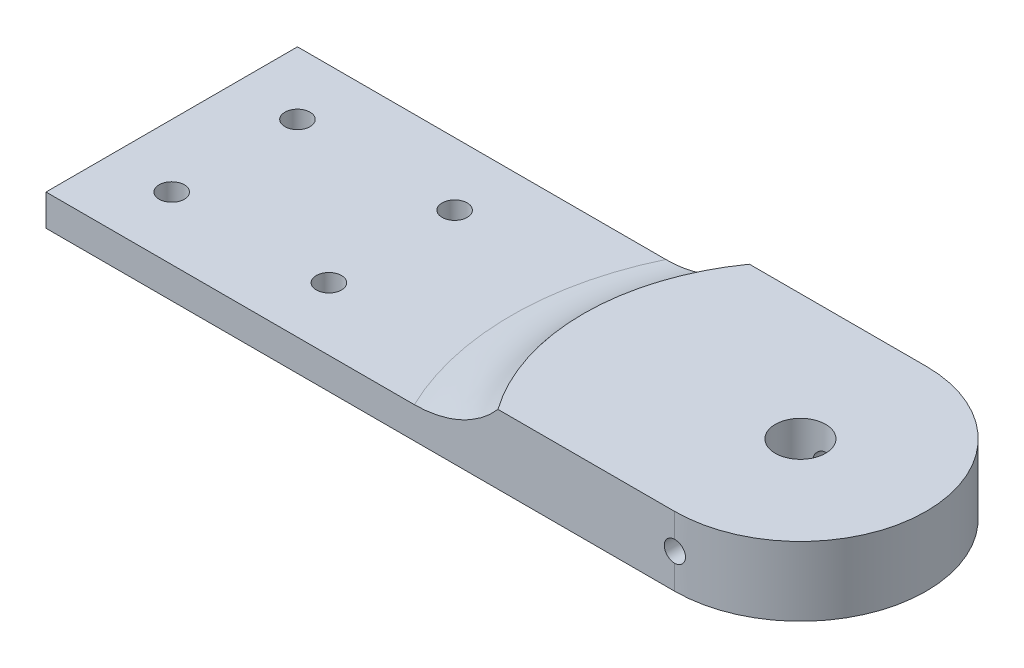
ISO-10303-21;
HEADER;
FILE_DESCRIPTION(('STEP AP214'),'2;1');
FILE_NAME('part.step','',(''),(''),'','','');
FILE_SCHEMA(('AUTOMOTIVE_DESIGN { 1 0 10303 214 1 1 1 1 }'));
ENDSEC;
DATA;
#1=APPLICATION_CONTEXT('core data for automotive mechanical design processes');
#2=APPLICATION_PROTOCOL_DEFINITION('international standard','automotive_design',2000,#1);
#3=PRODUCT_CONTEXT('',#1,'mechanical');
#4=PRODUCT('Part','Part','',(#3));
#5=PRODUCT_RELATED_PRODUCT_CATEGORY('part','',(#4));
#6=PRODUCT_DEFINITION_FORMATION('','',#4);
#7=PRODUCT_DEFINITION_CONTEXT('part definition',#1,'design');
#8=PRODUCT_DEFINITION('design','',#6,#7);
#9=PRODUCT_DEFINITION_SHAPE('','',#8);
#10=(LENGTH_UNIT() NAMED_UNIT(*) SI_UNIT(.MILLI.,.METRE.));
#11=(NAMED_UNIT(*) PLANE_ANGLE_UNIT() SI_UNIT($,.RADIAN.));
#12=(NAMED_UNIT(*) SI_UNIT($,.STERADIAN.) SOLID_ANGLE_UNIT());
#13=UNCERTAINTY_MEASURE_WITH_UNIT(LENGTH_MEASURE(1.E-05),#10,'distance_accuracy_value','');
#14=(GEOMETRIC_REPRESENTATION_CONTEXT(3) GLOBAL_UNCERTAINTY_ASSIGNED_CONTEXT((#13)) GLOBAL_UNIT_ASSIGNED_CONTEXT((#10,
#11,#12)) REPRESENTATION_CONTEXT('',''));
#15=CARTESIAN_POINT('',(0.,0.,0.));
#16=DIRECTION('',(0.,0.,1.));
#17=DIRECTION('',(1.,0.,0.));
#18=AXIS2_PLACEMENT_3D('',#15,#16,#17);
#19=CARTESIAN_POINT('',(0.,11.,20.));
#20=DIRECTION('',(0.,0.,1.));
#21=DIRECTION('',(1.,0.,0.));
#22=AXIS2_PLACEMENT_3D('',#19,#20,#21);
#23=PLANE('',#22);
#24=DIRECTION('',(0.,-1.,0.));
#25=VECTOR('',#24,1.);
#26=CARTESIAN_POINT('',(0.,11.,20.));
#27=LINE('',#26,#25);
#28=CARTESIAN_POINT('',(0.,3.85000000000001,20.));
#29=VERTEX_POINT('',#28);
#30=CARTESIAN_POINT('',(0.,0.,20.));
#31=VERTEX_POINT('',#30);
#32=EDGE_CURVE('E126',#29,#31,#27,.T.);
#33=ORIENTED_EDGE('',*,*,#32,.F.);
#34=CARTESIAN_POINT('',(0.,5.5,20.));
#35=DIRECTION('',(0.,0.,-1.));
#36=DIRECTION('',(-1.,0.,0.));
#37=AXIS2_PLACEMENT_3D('',#34,#35,#36);
#38=CIRCLE('',#37,1.64999999999999);
#39=CARTESIAN_POINT('',(0.,7.14999999999999,20.));
#40=VERTEX_POINT('',#39);
#41=EDGE_CURVE('E66',#29,#40,#38,.T.);
#42=ORIENTED_EDGE('',*,*,#41,.T.);
#43=CARTESIAN_POINT('',(0.,11.,20.));
#44=VERTEX_POINT('',#43);
#45=EDGE_CURVE('E123',#44,#40,#27,.T.);
#46=ORIENTED_EDGE('',*,*,#45,.F.);
#47=DIRECTION('',(-1.,0.,0.));
#48=VECTOR('',#47,1.);
#49=CARTESIAN_POINT('',(0.,11.,20.));
#50=LINE('',#49,#48);
#51=CARTESIAN_POINT('',(-28.1113855937412,11.,20.));
#52=VERTEX_POINT('',#51);
#53=EDGE_CURVE('E216',#44,#52,#50,.T.);
#54=ORIENTED_EDGE('',*,*,#53,.T.);
#55=CARTESIAN_POINT('',(-28.1113855937412,11.,20.));
#56=CARTESIAN_POINT('',(-28.2662442766593,10.8187919390475,20.));
#57=CARTESIAN_POINT('',(-28.4253331590326,10.641257561924,20.));
#58=CARTESIAN_POINT('',(-28.7514331358324,10.2936687575173,20.));
#59=CARTESIAN_POINT('',(-28.9184429983394,10.1236131749631,20.));
#60=CARTESIAN_POINT('',(-29.4303087027756,9.62508513091808,20.));
#61=CARTESIAN_POINT('',(-29.7862858891756,9.30791945492032,20.));
#62=CARTESIAN_POINT('',(-30.5232427028613,8.70537569331746,20.));
#63=CARTESIAN_POINT('',(-30.9041878097835,8.41995513158089,20.));
#64=CARTESIAN_POINT('',(-31.6882080925246,7.88117557433134,20.));
#65=CARTESIAN_POINT('',(-32.0912874861994,7.627822720175,20.));
#66=CARTESIAN_POINT('',(-32.9152092106033,7.1548289505815,20.));
#67=CARTESIAN_POINT('',(-33.3359976578665,6.93509403797252,20.));
#68=CARTESIAN_POINT('',(-34.1935511077908,6.52939191226646,20.));
#69=CARTESIAN_POINT('',(-34.6303165147607,6.34342555441911,20.));
#70=CARTESIAN_POINT('',(-35.5169425689714,6.0062941192341,20.));
#71=CARTESIAN_POINT('',(-35.966799262904,5.85511865609739,20.));
#72=CARTESIAN_POINT('',(-36.8768339881832,5.58854230796115,20.));
#73=CARTESIAN_POINT('',(-37.3370097917008,5.47313377935186,20.));
#74=CARTESIAN_POINT('',(-38.3949406716958,5.25191743324411,20.));
#75=CARTESIAN_POINT('',(-38.9952122308014,5.15780124613108,20.));
#76=CARTESIAN_POINT('',(-39.8997841260809,5.06334437099724,20.));
#77=CARTESIAN_POINT('',(-40.2018261440811,5.03964520850077,20.));
#78=CARTESIAN_POINT('',(-40.8067396467777,5.00797490181958,20.));
#79=CARTESIAN_POINT('',(-41.109611151761,5.00000414581166,20.));
#80=CARTESIAN_POINT('',(-41.412554198241,5.,20.));
#81=B_SPLINE_CURVE_WITH_KNOTS('',3,(#55,#56,#57,#58,#59,#60,#61,#62,#63,#64,#65,#66,#67,#68,#69,
#70,#71,#72,#73,#74,#75,#76,#77,#78,#79,#80),.UNSPECIFIED.,.F.,.F.,(4,2,2,2,2,2,2,2,2,2,2,2,4),
(0.,0.714946542589222,1.42978225459923,2.85814558027228,4.28457410770625,5.71127540157019,
7.13391165766226,8.55658393956637,9.97883097198032,11.4007738516984,13.2200056293425,
14.1285702782021,15.0371573501415),.UNSPECIFIED.);
#82=CARTESIAN_POINT('',(-41.412554198241,5.,20.));
#83=VERTEX_POINT('',#82);
#84=EDGE_CURVE('E59',#52,#83,#81,.T.);
#85=ORIENTED_EDGE('',*,*,#84,.T.);
#86=DIRECTION('',(-1.,0.,0.));
#87=VECTOR('',#86,1.);
#88=CARTESIAN_POINT('',(-100.,5.,20.));
#89=LINE('',#88,#87);
#90=CARTESIAN_POINT('',(-100.,5.,20.));
#91=VERTEX_POINT('',#90);
#92=EDGE_CURVE('E193',#83,#91,#89,.T.);
#93=ORIENTED_EDGE('',*,*,#92,.T.);
#94=DIRECTION('',(0.,-1.,0.));
#95=VECTOR('',#94,1.);
#96=CARTESIAN_POINT('',(-100.,11.,20.));
#97=LINE('',#96,#95);
#98=CARTESIAN_POINT('',(-100.,0.,20.));
#99=VERTEX_POINT('',#98);
#100=EDGE_CURVE('E222',#91,#99,#97,.T.);
#101=ORIENTED_EDGE('',*,*,#100,.T.);
#102=DIRECTION('',(-1.,0.,0.));
#103=VECTOR('',#102,1.);
#104=CARTESIAN_POINT('',(0.,0.,20.));
#105=LINE('',#104,#103);
#106=EDGE_CURVE('E237',#31,#99,#105,.T.);
#107=ORIENTED_EDGE('',*,*,#106,.F.);
#108=EDGE_LOOP('',(#33,#42,#46,#54,#85,#93,#101,#107));
#109=FACE_BOUND('',#108,.T.);
#110=ADVANCED_FACE('F44',(#109),#23,.T.);
#111=CARTESIAN_POINT('',(-90.,11.,-10.));
#112=DIRECTION('',(0.,-1.,0.));
#113=DIRECTION('',(0.,0.,-1.));
#114=AXIS2_PLACEMENT_3D('',#111,#112,#113);
#115=CYLINDRICAL_SURFACE('',#114,2.);
#116=CARTESIAN_POINT('',(-90.,0.,-10.));
#117=DIRECTION('',(0.,1.,0.));
#118=DIRECTION('',(0.,0.,1.));
#119=AXIS2_PLACEMENT_3D('',#116,#117,#118);
#120=CIRCLE('',#119,2.);
#121=CARTESIAN_POINT('',(-90.,0.,-8.));
#122=VERTEX_POINT('',#121);
#123=EDGE_CURVE('E231',#122,#122,#120,.T.);
#124=ORIENTED_EDGE('',*,*,#123,.F.);
#125=EDGE_LOOP('',(#124));
#126=FACE_BOUND('',#125,.T.);
#127=CARTESIAN_POINT('',(-90.,5.,-10.));
#128=DIRECTION('',(0.,1.,0.));
#129=DIRECTION('',(0.,0.,1.));
#130=AXIS2_PLACEMENT_3D('',#127,#128,#129);
#131=CIRCLE('',#130,2.);
#132=CARTESIAN_POINT('',(-90.,5.,-8.));
#133=VERTEX_POINT('',#132);
#134=EDGE_CURVE('E209',#133,#133,#131,.T.);
#135=ORIENTED_EDGE('',*,*,#134,.T.);
#136=EDGE_LOOP('',(#135));
#137=FACE_BOUND('',#136,.T.);
#138=ADVANCED_FACE('F154',(#126,#137),#115,.F.);
#139=CARTESIAN_POINT('',(-65.,11.,-10.));
#140=DIRECTION('',(0.,-1.,0.));
#141=DIRECTION('',(0.,0.,-1.));
#142=AXIS2_PLACEMENT_3D('',#139,#140,#141);
#143=CYLINDRICAL_SURFACE('',#142,2.);
#144=CARTESIAN_POINT('',(-65.,0.,-10.));
#145=DIRECTION('',(0.,1.,0.));
#146=DIRECTION('',(0.,0.,1.));
#147=AXIS2_PLACEMENT_3D('',#144,#145,#146);
#148=CIRCLE('',#147,2.);
#149=CARTESIAN_POINT('',(-65.,0.,-8.));
#150=VERTEX_POINT('',#149);
#151=EDGE_CURVE('E228',#150,#150,#148,.T.);
#152=ORIENTED_EDGE('',*,*,#151,.F.);
#153=EDGE_LOOP('',(#152));
#154=FACE_BOUND('',#153,.T.);
#155=CARTESIAN_POINT('',(-65.,5.,-10.));
#156=DIRECTION('',(0.,1.,0.));
#157=DIRECTION('',(0.,0.,1.));
#158=AXIS2_PLACEMENT_3D('',#155,#156,#157);
#159=CIRCLE('',#158,2.);
#160=CARTESIAN_POINT('',(-65.,5.,-8.));
#161=VERTEX_POINT('',#160);
#162=EDGE_CURVE('E206',#161,#161,#159,.T.);
#163=ORIENTED_EDGE('',*,*,#162,.T.);
#164=EDGE_LOOP('',(#163));
#165=FACE_BOUND('',#164,.T.);
#166=ADVANCED_FACE('F320',(#154,#165),#143,.F.);
#167=CARTESIAN_POINT('',(-65.,11.,10.));
#168=DIRECTION('',(0.,-1.,0.));
#169=DIRECTION('',(0.,0.,-1.));
#170=AXIS2_PLACEMENT_3D('',#167,#168,#169);
#171=CYLINDRICAL_SURFACE('',#170,2.00000000000001);
#172=CARTESIAN_POINT('',(-65.,0.,10.));
#173=DIRECTION('',(0.,1.,0.));
#174=DIRECTION('',(0.,0.,1.));
#175=AXIS2_PLACEMENT_3D('',#172,#173,#174);
#176=CIRCLE('',#175,2.00000000000001);
#177=CARTESIAN_POINT('',(-65.,0.,12.));
#178=VERTEX_POINT('',#177);
#179=EDGE_CURVE('E225',#178,#178,#176,.T.);
#180=ORIENTED_EDGE('',*,*,#179,.F.);
#181=EDGE_LOOP('',(#180));
#182=FACE_BOUND('',#181,.T.);
#183=CARTESIAN_POINT('',(-65.,5.,10.));
#184=DIRECTION('',(0.,1.,0.));
#185=DIRECTION('',(0.,0.,1.));
#186=AXIS2_PLACEMENT_3D('',#183,#184,#185);
#187=CIRCLE('',#186,2.00000000000001);
#188=CARTESIAN_POINT('',(-65.,5.,12.));
#189=VERTEX_POINT('',#188);
#190=EDGE_CURVE('E203',#189,#189,#187,.T.);
#191=ORIENTED_EDGE('',*,*,#190,.T.);
#192=EDGE_LOOP('',(#191));
#193=FACE_BOUND('',#192,.T.);
#194=ADVANCED_FACE('F313',(#182,#193),#171,.F.);
#195=CARTESIAN_POINT('',(-90.,11.,10.));
#196=DIRECTION('',(0.,-1.,0.));
#197=DIRECTION('',(0.,0.,-1.));
#198=AXIS2_PLACEMENT_3D('',#195,#196,#197);
#199=CYLINDRICAL_SURFACE('',#198,2.00000000000001);
#200=CARTESIAN_POINT('',(-90.,0.,10.));
#201=DIRECTION('',(0.,1.,0.));
#202=DIRECTION('',(0.,0.,1.));
#203=AXIS2_PLACEMENT_3D('',#200,#201,#202);
#204=CIRCLE('',#203,2.00000000000001);
#205=CARTESIAN_POINT('',(-90.,0.,12.));
#206=VERTEX_POINT('',#205);
#207=EDGE_CURVE('E212',#206,#206,#204,.T.);
#208=ORIENTED_EDGE('',*,*,#207,.F.);
#209=EDGE_LOOP('',(#208));
#210=FACE_BOUND('',#209,.T.);
#211=CARTESIAN_POINT('',(-90.,5.,10.));
#212=DIRECTION('',(0.,1.,0.));
#213=DIRECTION('',(0.,0.,1.));
#214=AXIS2_PLACEMENT_3D('',#211,#212,#213);
#215=CIRCLE('',#214,2.00000000000001);
#216=CARTESIAN_POINT('',(-90.,5.,12.));
#217=VERTEX_POINT('',#216);
#218=EDGE_CURVE('E200',#217,#217,#215,.T.);
#219=ORIENTED_EDGE('',*,*,#218,.T.);
#220=EDGE_LOOP('',(#219));
#221=FACE_BOUND('',#220,.T.);
#222=ADVANCED_FACE('F293',(#210,#221),#199,.F.);
#223=CARTESIAN_POINT('',(-100.,11.,0.));
#224=DIRECTION('',(-1.,0.,0.));
#225=DIRECTION('',(0.,0.,1.));
#226=AXIS2_PLACEMENT_3D('',#223,#224,#225);
#227=PLANE('',#226);
#228=ORIENTED_EDGE('',*,*,#100,.F.);
#229=DIRECTION('',(0.,0.,-1.));
#230=VECTOR('',#229,1.);
#231=CARTESIAN_POINT('',(-100.,5.,-20.));
#232=LINE('',#231,#230);
#233=CARTESIAN_POINT('',(-100.,5.,-20.));
#234=VERTEX_POINT('',#233);
#235=EDGE_CURVE('E190',#91,#234,#232,.T.);
#236=ORIENTED_EDGE('',*,*,#235,.T.);
#237=DIRECTION('',(0.,-1.,0.));
#238=VECTOR('',#237,1.);
#239=CARTESIAN_POINT('',(-100.,11.,-20.));
#240=LINE('',#239,#238);
#241=CARTESIAN_POINT('',(-100.,0.,-20.));
#242=VERTEX_POINT('',#241);
#243=EDGE_CURVE('E248',#234,#242,#240,.T.);
#244=ORIENTED_EDGE('',*,*,#243,.T.);
#245=DIRECTION('',(0.,0.,-1.));
#246=VECTOR('',#245,1.);
#247=CARTESIAN_POINT('',(-100.,0.,0.));
#248=LINE('',#247,#246);
#249=EDGE_CURVE('E217',#99,#242,#248,.T.);
#250=ORIENTED_EDGE('',*,*,#249,.F.);
#251=EDGE_LOOP('',(#228,#236,#244,#250));
#252=FACE_BOUND('',#251,.T.);
#253=ADVANCED_FACE('F278',(#252),#227,.T.);
#254=CARTESIAN_POINT('',(0.,11.,0.));
#255=DIRECTION('',(0.,-1.,0.));
#256=DIRECTION('',(0.,0.,-1.));
#257=AXIS2_PLACEMENT_3D('',#254,#255,#256);
#258=CYLINDRICAL_SURFACE('',#257,20.);
#259=ORIENTED_EDGE('',*,*,#45,.T.);
#260=CARTESIAN_POINT('',(0.,7.14999999999999,20.));
#261=CARTESIAN_POINT('',(0.0463374530266326,7.14999978515549,20.0000009002494));
#262=CARTESIAN_POINT('',(0.0926526303583241,7.14804681017579,19.9998387586117));
#263=CARTESIAN_POINT('',(0.184950047798817,7.14025621004927,19.9991979392104));
#264=CARTESIAN_POINT('',(0.230932307829086,7.13441881931724,19.998719280548));
#265=CARTESIAN_POINT('',(0.367797161351564,7.11113791927977,19.9968250113476));
#266=CARTESIAN_POINT('',(0.457760529407643,7.08792551419507,19.9949510427132));
#267=CARTESIAN_POINT('',(0.632493331567625,7.02677295113281,19.9901880284341));
#268=CARTESIAN_POINT('',(0.717260644978936,6.98882682553945,19.9872985715301));
#269=CARTESIAN_POINT('',(0.879223345519314,6.89929347487904,19.9808292168816));
#270=CARTESIAN_POINT('',(0.956419829232706,6.84770822936017,19.9772494193519));
#271=CARTESIAN_POINT('',(1.10123036371559,6.73222892683302,19.9697914692836));
#272=CARTESIAN_POINT('',(1.16882367414018,6.66830891106177,19.9659126980748));
#273=CARTESIAN_POINT('',(1.29234416178629,6.5300206555477,19.9582986640416));
#274=CARTESIAN_POINT('',(1.34826955889242,6.45565082442081,19.9545634231858));
#275=CARTESIAN_POINT('',(1.44692755097869,6.29845097812383,19.9476529707548));
#276=CARTESIAN_POINT('',(1.48964151382764,6.21560923195131,19.9444785527895));
#277=CARTESIAN_POINT('',(1.56054306830961,6.04390417210435,19.9390565717303));
#278=CARTESIAN_POINT('',(1.58873179490855,5.95504132951756,19.9368089362228));
#279=CARTESIAN_POINT('',(1.62972440108988,5.7740264033624,19.9335000630318));
#280=CARTESIAN_POINT('',(1.64256314699781,5.68188226556886,19.9324361370248));
#281=CARTESIAN_POINT('',(1.65259913533773,5.49673893437925,19.9316066277062));
#282=CARTESIAN_POINT('',(1.64979628195515,5.40373973574887,19.9318410523479));
#283=CARTESIAN_POINT('',(1.62865690198483,5.21977019590212,19.9335793610254));
#284=CARTESIAN_POINT('',(1.61035871801433,5.1287954150933,19.9350801115523));
#285=CARTESIAN_POINT('',(1.55880772379246,4.95121324574759,19.9391770486115));
#286=CARTESIAN_POINT('',(1.52555484116396,4.86460587835018,19.9417732404454));
#287=CARTESIAN_POINT('',(1.44499469273342,4.69809266387787,19.9477722000453));
#288=CARTESIAN_POINT('',(1.39766992909299,4.61819532002404,19.9511759709333));
#289=CARTESIAN_POINT('',(1.29032416634934,4.46746726382584,19.9584054319867));
#290=CARTESIAN_POINT('',(1.23030349877046,4.39663631481093,19.9622311111335));
#291=CARTESIAN_POINT('',(1.09906433519399,4.26583388479779,19.9698868576847));
#292=CARTESIAN_POINT('',(1.02781427507157,4.20589407163479,19.9737169062998));
#293=CARTESIAN_POINT('',(0.876218395662151,4.09880268233829,19.9809406392434));
#294=CARTESIAN_POINT('',(0.79586978312832,4.05165504855976,19.9843341888805));
#295=CARTESIAN_POINT('',(0.628326691277307,3.9714901656766,19.9903035756534));
#296=CARTESIAN_POINT('',(0.541127454871435,3.93848284012087,19.9928788381958));
#297=CARTESIAN_POINT('',(0.362464716778224,3.88763605726371,19.9969138756495));
#298=CARTESIAN_POINT('',(0.271007906284407,3.86977359430027,19.9983753421195));
#299=CARTESIAN_POINT('',(0.14910101052428,3.85647699511851,19.9994666010116));
#300=CARTESIAN_POINT('',(0.119306593596534,3.85404688914201,19.9996665103115));
#301=CARTESIAN_POINT('',(0.0596788873965102,3.85081059357679,19.9999330403612));
#302=CARTESIAN_POINT('',(0.0298457458053656,3.85000170267231,19.9999998828295));
#303=CARTESIAN_POINT('',(0.,3.85000000000001,20.));
#304=B_SPLINE_CURVE_WITH_KNOTS('',3,(#260,#261,#262,#263,#264,#265,#266,#267,#268,#269,#270,
#271,#272,#273,#274,#275,#276,#277,#278,#279,#280,#281,#282,#283,#284,#285,#286,#287,#288,#289,
#290,#291,#292,#293,#294,#295,#296,#297,#298,#299,#300,#301,#302,#303),.UNSPECIFIED.,.F.,.F.,(4,
2,2,2,2,2,2,2,2,2,2,2,2,2,2,2,2,2,2,2,2,4),(0.,0.138926730582758,0.277845078044808,
0.555199898453637,0.832667173586559,1.11009419988982,1.38811157277445,1.66617133041774,
1.94462146721372,2.22304984330635,2.50084458145177,2.77864102126544,3.05575206602342,
3.3328644519464,3.61032286770351,3.88777403916605,4.16601946942906,4.44435055354759,
4.72287664935229,5.00097889078129,5.09062940130362,5.18013040893359),.UNSPECIFIED.);
#305=EDGE_CURVE('E113',#40,#29,#304,.T.);
#306=ORIENTED_EDGE('',*,*,#305,.T.);
#307=ORIENTED_EDGE('',*,*,#32,.T.);
#308=CARTESIAN_POINT('',(0.,0.,0.));
#309=DIRECTION('',(0.,1.,0.));
#310=DIRECTION('',(0.,0.,1.));
#311=AXIS2_PLACEMENT_3D('',#308,#309,#310);
#312=CIRCLE('',#311,20.);
#313=CARTESIAN_POINT('',(0.,0.,-20.));
#314=VERTEX_POINT('',#313);
#315=EDGE_CURVE('E240',#31,#314,#312,.T.);
#316=ORIENTED_EDGE('',*,*,#315,.T.);
#317=DIRECTION('',(0.,-1.,0.));
#318=VECTOR('',#317,1.);
#319=CARTESIAN_POINT('',(0.,11.,-20.));
#320=LINE('',#319,#318);
#321=CARTESIAN_POINT('',(0.,3.85000000000001,-20.));
#322=VERTEX_POINT('',#321);
#323=EDGE_CURVE('E249',#322,#314,#320,.T.);
#324=ORIENTED_EDGE('',*,*,#323,.F.);
#325=CARTESIAN_POINT('',(0.,3.85000000000001,-20.));
#326=CARTESIAN_POINT('',(0.0463374530266303,3.85000021484451,-20.0000009002494));
#327=CARTESIAN_POINT('',(0.0926526303583217,3.85195318982421,-19.9998387586117));
#328=CARTESIAN_POINT('',(0.184950047798815,3.85974378995073,-19.9991979392104));
#329=CARTESIAN_POINT('',(0.230932307829083,3.86558118068276,-19.998719280548));
#330=CARTESIAN_POINT('',(0.367797161351561,3.88886208072023,-19.9968250113476));
#331=CARTESIAN_POINT('',(0.457760529407641,3.91207448580493,-19.9949510427132));
#332=CARTESIAN_POINT('',(0.632493331567623,3.97322704886718,-19.9901880284341));
#333=CARTESIAN_POINT('',(0.717260644978935,4.01117317446055,-19.9872985715301));
#334=CARTESIAN_POINT('',(0.879223345519313,4.10070652512096,-19.9808292168816));
#335=CARTESIAN_POINT('',(0.956419829232704,4.15229177063983,-19.9772494193519));
#336=CARTESIAN_POINT('',(1.10123036371559,4.26777107316698,-19.9697914692836));
#337=CARTESIAN_POINT('',(1.16882367414017,4.33169108893823,-19.9659126980748));
#338=CARTESIAN_POINT('',(1.29234416178629,4.4699793444523,-19.9582986640416));
#339=CARTESIAN_POINT('',(1.34826955889242,4.54434917557919,-19.9545634231858));
#340=CARTESIAN_POINT('',(1.44692755097869,4.70154902187617,-19.9476529707548));
#341=CARTESIAN_POINT('',(1.48964151382764,4.78439076804869,-19.9444785527895));
#342=CARTESIAN_POINT('',(1.56054306830961,4.95609582789565,-19.9390565717303));
#343=CARTESIAN_POINT('',(1.58873179490855,5.04495867048244,-19.9368089362228));
#344=CARTESIAN_POINT('',(1.62972440108988,5.2259735966376,-19.9335000630318));
#345=CARTESIAN_POINT('',(1.64256314699781,5.31811773443113,-19.9324361370248));
#346=CARTESIAN_POINT('',(1.65259913533773,5.50326106562075,-19.9316066277062));
#347=CARTESIAN_POINT('',(1.64979628195515,5.59626026425113,-19.9318410523479));
#348=CARTESIAN_POINT('',(1.62865690198483,5.78022980409788,-19.9335793610254));
#349=CARTESIAN_POINT('',(1.61035871801433,5.8712045849067,-19.9350801115523));
#350=CARTESIAN_POINT('',(1.55880772379246,6.04878675425241,-19.9391770486115));
#351=CARTESIAN_POINT('',(1.52555484116396,6.13539412164982,-19.9417732404454));
#352=CARTESIAN_POINT('',(1.44499469273342,6.30190733612213,-19.9477722000453));
#353=CARTESIAN_POINT('',(1.39766992909299,6.38180467997596,-19.9511759709333));
#354=CARTESIAN_POINT('',(1.29032416634934,6.53253273617415,-19.9584054319867));
#355=CARTESIAN_POINT('',(1.23030349877046,6.60336368518907,-19.9622311111335));
#356=CARTESIAN_POINT('',(1.09906433519399,6.73416611520221,-19.9698868576847));
#357=CARTESIAN_POINT('',(1.02781427507157,6.79410592836521,-19.9737169062998));
#358=CARTESIAN_POINT('',(0.876218395662153,6.90119731766171,-19.9809406392434));
#359=CARTESIAN_POINT('',(0.795869783128321,6.94834495144024,-19.9843341888805));
#360=CARTESIAN_POINT('',(0.628326691277309,7.0285098343234,-19.9903035756534));
#361=CARTESIAN_POINT('',(0.541127454871438,7.06151715987913,-19.9928788381958));
#362=CARTESIAN_POINT('',(0.362464716778227,7.11236394273628,-19.9969138756495));
#363=CARTESIAN_POINT('',(0.271007906284409,7.13022640569973,-19.9983753421195));
#364=CARTESIAN_POINT('',(0.149101010524281,7.14352300488149,-19.9994666010116));
#365=CARTESIAN_POINT('',(0.119306593596534,7.14595311085799,-19.9996665103115));
#366=CARTESIAN_POINT('',(0.0596788873965091,7.14918940642321,-19.9999330403612));
#367=CARTESIAN_POINT('',(0.029845745805364,7.14999829732769,-19.9999998828295));
#368=CARTESIAN_POINT('',(0.,7.14999999999999,-20.));
#369=B_SPLINE_CURVE_WITH_KNOTS('',3,(#325,#326,#327,#328,#329,#330,#331,#332,#333,#334,#335,
#336,#337,#338,#339,#340,#341,#342,#343,#344,#345,#346,#347,#348,#349,#350,#351,#352,#353,#354,
#355,#356,#357,#358,#359,#360,#361,#362,#363,#364,#365,#366,#367,#368),.UNSPECIFIED.,.F.,.F.,(4,
2,2,2,2,2,2,2,2,2,2,2,2,2,2,2,2,2,2,2,2,4),(0.,0.138926730582758,0.277845078044808,
0.555199898453637,0.832667173586559,1.11009419988983,1.38811157277445,1.66617133041774,
1.94462146721372,2.22304984330635,2.50084458145177,2.77864102126544,3.05575206602342,
3.3328644519464,3.61032286770351,3.88777403916605,4.16601946942906,4.44435055354759,
4.72287664935229,5.00097889078129,5.09062940130363,5.18013040893359),.UNSPECIFIED.);
#370=CARTESIAN_POINT('',(0.,7.14999999999999,-20.));
#371=VERTEX_POINT('',#370);
#372=EDGE_CURVE('E119',#322,#371,#369,.T.);
#373=ORIENTED_EDGE('',*,*,#372,.T.);
#374=CARTESIAN_POINT('',(0.,11.,-20.));
#375=VERTEX_POINT('',#374);
#376=EDGE_CURVE('E137',#375,#371,#320,.T.);
#377=ORIENTED_EDGE('',*,*,#376,.F.);
#378=CARTESIAN_POINT('',(0.,11.,0.));
#379=DIRECTION('',(0.,1.,0.));
#380=DIRECTION('',(0.,0.,1.));
#381=AXIS2_PLACEMENT_3D('',#378,#379,#380);
#382=CIRCLE('',#381,20.);
#383=EDGE_CURVE('E132',#44,#375,#382,.T.);
#384=ORIENTED_EDGE('',*,*,#383,.F.);
#385=EDGE_LOOP('',(#259,#306,#307,#316,#324,#373,#377,#384));
#386=FACE_BOUND('',#385,.T.);
#387=ADVANCED_FACE('F129',(#386),#258,.T.);
#388=CARTESIAN_POINT('',(0.,11.,-20.));
#389=DIRECTION('',(0.,0.,-1.));
#390=DIRECTION('',(-1.,0.,0.));
#391=AXIS2_PLACEMENT_3D('',#388,#389,#390);
#392=PLANE('',#391);
#393=CARTESIAN_POINT('',(0.,5.5,-20.));
#394=DIRECTION('',(0.,0.,-1.));
#395=DIRECTION('',(-1.,0.,0.));
#396=AXIS2_PLACEMENT_3D('',#393,#394,#395);
#397=CIRCLE('',#396,1.64999999999999);
#398=EDGE_CURVE('E73',#322,#371,#397,.T.);
#399=ORIENTED_EDGE('',*,*,#398,.F.);
#400=ORIENTED_EDGE('',*,*,#323,.T.);
#401=DIRECTION('',(1.,0.,0.));
#402=VECTOR('',#401,1.);
#403=CARTESIAN_POINT('',(0.,0.,-20.));
#404=LINE('',#403,#402);
#405=EDGE_CURVE('E243',#242,#314,#404,.T.);
#406=ORIENTED_EDGE('',*,*,#405,.F.);
#407=ORIENTED_EDGE('',*,*,#243,.F.);
#408=DIRECTION('',(1.,0.,0.));
#409=VECTOR('',#408,1.);
#410=CARTESIAN_POINT('',(-28.1113855937412,5.,-20.));
#411=LINE('',#410,#409);
#412=CARTESIAN_POINT('',(-41.412554198241,5.,-20.));
#413=VERTEX_POINT('',#412);
#414=EDGE_CURVE('E195',#234,#413,#411,.T.);
#415=ORIENTED_EDGE('',*,*,#414,.T.);
#416=CARTESIAN_POINT('',(-41.412554198241,5.,-20.));
#417=CARTESIAN_POINT('',(-40.9107313653627,4.99997727317924,-20.));
#418=CARTESIAN_POINT('',(-40.4089878888428,5.02187684133305,-20.));
#419=CARTESIAN_POINT('',(-39.409307156338,5.10841365483462,-20.));
#420=CARTESIAN_POINT('',(-38.9113690370042,5.1730408963715,-20.));
#421=CARTESIAN_POINT('',(-37.9213172578317,5.34416760243984,-20.));
#422=CARTESIAN_POINT('',(-37.4292239313221,5.45078438523418,-20.));
#423=CARTESIAN_POINT('',(-36.4556431802604,5.70467047881275,-20.));
#424=CARTESIAN_POINT('',(-35.9741561321895,5.85194123015012,-20.));
#425=CARTESIAN_POINT('',(-35.0253123132645,6.18585977779347,-20.));
#426=CARTESIAN_POINT('',(-34.5579469849794,6.37248315708656,-20.));
#427=CARTESIAN_POINT('',(-33.6404794484667,6.78385946260115,-20.));
#428=CARTESIAN_POINT('',(-33.190379040195,7.00861635125951,-20.));
#429=CARTESIAN_POINT('',(-31.8729720674263,7.73745828895803,-20.));
#430=CARTESIAN_POINT('',(-31.0351313064264,8.29731926247062,-20.));
#431=CARTESIAN_POINT('',(-29.8662718579633,9.23825884852729,-20.));
#432=CARTESIAN_POINT('',(-29.4923939646782,9.56751099800323,-20.));
#433=CARTESIAN_POINT('',(-28.9556108370345,10.0862269819874,-20.));
#434=CARTESIAN_POINT('',(-28.7806966379089,10.2632627589447,-20.));
#435=CARTESIAN_POINT('',(-28.4394361117699,10.6255333953614,-20.));
#436=CARTESIAN_POINT('',(-28.2730931181499,10.8107713934125,-20.));
#437=CARTESIAN_POINT('',(-28.1113855937412,11.,-20.));
#438=B_SPLINE_CURVE_WITH_KNOTS('',3,(#416,#417,#418,#419,#420,#421,#422,#423,#424,#425,#426,
#427,#428,#429,#430,#431,#432,#433,#434,#435,#436,#437),.UNSPECIFIED.,.F.,.F.,(4,2,2,2,2,2,2,2,
2,2,4),(0.,1.50487610688046,3.00940000251146,4.51815768581296,6.02696883805567,7.534846562776,
9.04288106650051,12.0481738073964,13.5409906320905,14.2873267381797,15.0339509414301),.UNSPECIFIED.);
#439=CARTESIAN_POINT('',(-28.1113855937412,11.,-20.));
#440=VERTEX_POINT('',#439);
#441=EDGE_CURVE('E12',#413,#440,#438,.T.);
#442=ORIENTED_EDGE('',*,*,#441,.T.);
#443=DIRECTION('',(1.,0.,0.));
#444=VECTOR('',#443,1.);
#445=CARTESIAN_POINT('',(0.,11.,-20.));
#446=LINE('',#445,#444);
#447=EDGE_CURVE('E220',#440,#375,#446,.T.);
#448=ORIENTED_EDGE('',*,*,#447,.T.);
#449=ORIENTED_EDGE('',*,*,#376,.T.);
#450=EDGE_LOOP('',(#399,#400,#406,#407,#415,#442,#448,#449));
#451=FACE_BOUND('',#450,.T.);
#452=ADVANCED_FACE('F161',(#451),#392,.T.);
#453=CARTESIAN_POINT('',(0.,11.,0.));
#454=DIRECTION('',(0.,-1.,0.));
#455=DIRECTION('',(0.,0.,-1.));
#456=AXIS2_PLACEMENT_3D('',#453,#454,#455);
#457=CYLINDRICAL_SURFACE('',#456,4.);
#458=CARTESIAN_POINT('',(0.,7.14999999999999,-4.));
#459=CARTESIAN_POINT('',(-0.0884596783632786,7.14999078279336,-3.99999309817074));
#460=CARTESIAN_POINT('',(-0.177062252057582,7.14284398565668,-3.99703145792172));
#461=CARTESIAN_POINT('',(-0.351759669836408,7.1145088580631,-3.9854711320255));
#462=CARTESIAN_POINT('',(-0.437847271996959,7.09328348897568,-3.97685757767606));
#463=CARTESIAN_POINT('',(-0.604702496902738,7.0377051877981,-3.95491965529936));
#464=CARTESIAN_POINT('',(-0.685486934491193,7.00339635664654,-3.94161112398211));
#465=CARTESIAN_POINT('',(-0.840076633223484,6.92280524215057,-3.91158286286531));
#466=CARTESIAN_POINT('',(-0.913884076117562,6.87652671882983,-3.89486420463244));
#467=CARTESIAN_POINT('',(-1.05618769598525,6.77089324535594,-3.85876900012149));
#468=CARTESIAN_POINT('',(-1.12429373957476,6.71104232975102,-3.83930654387258));
#469=CARTESIAN_POINT('',(-1.24983574384756,6.58101116034102,-3.80029483347099));
#470=CARTESIAN_POINT('',(-1.30726618926956,6.51082560078819,-3.78074553976622));
#471=CARTESIAN_POINT('',(-1.41254826809049,6.35803175112828,-3.74272551686067));
#472=CARTESIAN_POINT('',(-1.45980781790561,6.27498888469347,-3.72435159658093));
#473=CARTESIAN_POINT('',(-1.53951358199406,6.10126369070982,-3.69212136090387));
#474=CARTESIAN_POINT('',(-1.5719672771279,6.01058524863699,-3.67826276509115));
#475=CARTESIAN_POINT('',(-1.61953738222491,5.82865200299817,-3.65756021871623));
#476=CARTESIAN_POINT('',(-1.63540371417153,5.73762892785693,-3.65041449103237));
#477=CARTESIAN_POINT('',(-1.65168918120802,5.55395349263472,-3.64307714795703));
#478=CARTESIAN_POINT('',(-1.65211659474,5.4613020323707,-3.64288180572738));
#479=CARTESIAN_POINT('',(-1.63807780779829,5.28440111338128,-3.64921138579605));
#480=CARTESIAN_POINT('',(-1.62472398487458,5.20004184125084,-3.65523439741041));
#481=CARTESIAN_POINT('',(-1.58536484231197,5.03488971561883,-3.67247532251837));
#482=CARTESIAN_POINT('',(-1.55935715587184,4.9540975323967,-3.68369420783859));
#483=CARTESIAN_POINT('',(-1.49492412942488,4.79635489124138,-3.71031458481431));
#484=CARTESIAN_POINT('',(-1.45624866973016,4.71952126219167,-3.72579923184192));
#485=CARTESIAN_POINT('',(-1.36775445443624,4.57313976753997,-3.75918616236907));
#486=CARTESIAN_POINT('',(-1.31793135478158,4.50359475775085,-3.77708938726885));
#487=CARTESIAN_POINT('',(-1.20371911924868,4.36771359221219,-3.81509742396095));
#488=CARTESIAN_POINT('',(-1.13846630094388,4.30211804229675,-3.8352618825369));
#489=CARTESIAN_POINT('',(-0.997682554866208,4.18255532555863,-3.87426910607353));
#490=CARTESIAN_POINT('',(-0.922149319847427,4.12859077613917,-3.8931115728953));
#491=CARTESIAN_POINT('',(-0.760736369737319,4.03276522641497,-3.92787932271737));
#492=CARTESIAN_POINT('',(-0.674664094072231,3.99119971680583,-3.94373050716791));
#493=CARTESIAN_POINT('',(-0.495928253552972,3.92339697589113,-3.97016319816605));
#494=CARTESIAN_POINT('',(-0.403268287372381,3.89715144678884,-3.98074755693754));
#495=CARTESIAN_POINT('',(-0.220181304317671,3.86227049632179,-3.99492450637935));
#496=CARTESIAN_POINT('',(-0.12997417230822,3.85264082206407,-3.99891121146315));
#497=CARTESIAN_POINT('',(0.0508474401522235,3.84830795623671,-4.00069746426785));
#498=CARTESIAN_POINT('',(0.141461799500567,3.85360058689179,-3.99849874371343));
#499=CARTESIAN_POINT('',(0.315907755487548,3.87824526824296,-3.98841747083847));
#500=CARTESIAN_POINT('',(0.399855317526684,3.8969040733401,-3.9808153168881));
#501=CARTESIAN_POINT('',(0.563340473329573,3.94679209633712,-3.96098887803091));
#502=CARTESIAN_POINT('',(0.642877505872145,3.9780229098148,-3.94876400644332));
#503=CARTESIAN_POINT('',(0.798061975964473,4.0531893799809,-3.92039728883464));
#504=CARTESIAN_POINT('',(0.873512656660504,4.09748856175622,-3.90414585630856));
#505=CARTESIAN_POINT('',(1.01617847320907,4.19713393425787,-3.86946768187548));
#506=CARTESIAN_POINT('',(1.0833901834211,4.25248469508984,-3.85104004134398));
#507=CARTESIAN_POINT('',(1.21261994292741,4.37720430481198,-3.8124029584454));
#508=CARTESIAN_POINT('',(1.27394364561821,4.4472838240393,-3.79215916493832));
#509=CARTESIAN_POINT('',(1.38414835482505,4.59707129060853,-3.75333928940831));
#510=CARTESIAN_POINT('',(1.43302674162726,4.67678125994256,-3.73476355904109));
#511=CARTESIAN_POINT('',(1.51742282291387,4.84509537053332,-3.70128700339843));
#512=CARTESIAN_POINT('',(1.55275802936534,4.93380191600806,-3.68643724424496));
#513=CARTESIAN_POINT('',(1.60769618165393,5.11670916597825,-3.66281640168181));
#514=CARTESIAN_POINT('',(1.62731175174752,5.21090539641818,-3.65404044124936));
#515=CARTESIAN_POINT('',(1.64901123940267,5.39443027315807,-3.64429559365239));
#516=CARTESIAN_POINT('',(1.65231049364124,5.48358721945794,-3.64278573581524));
#517=CARTESIAN_POINT('',(1.64451485356567,5.66112847075918,-3.64631178238904));
#518=CARTESIAN_POINT('',(1.63342206561729,5.74951288691937,-3.65134672892697));
#519=CARTESIAN_POINT('',(1.59817118006571,5.9189330712577,-3.666904904187));
#520=CARTESIAN_POINT('',(1.57461958437453,6.00012071142211,-3.67717261200251));
#521=CARTESIAN_POINT('',(1.51570599472927,6.15741452247408,-3.70184411206584));
#522=CARTESIAN_POINT('',(1.48034069596892,6.23351926429761,-3.71624906152171));
#523=CARTESIAN_POINT('',(1.39638062253789,6.3834220382414,-3.74863408895161));
#524=CARTESIAN_POINT('',(1.3471244359927,6.45681407102141,-3.76677577854003));
#525=CARTESIAN_POINT('',(1.23771718137822,6.59467168726428,-3.80412864636709));
#526=CARTESIAN_POINT('',(1.17756245772961,6.65913426277442,-3.82334018195057));
#527=CARTESIAN_POINT('',(1.04300738755743,6.78199413870367,-3.86230172013188));
#528=CARTESIAN_POINT('',(0.96790011073017,6.83963922360552,-3.88199359359226));
#529=CARTESIAN_POINT('',(0.808343463182028,6.94154015953871,-3.91832426905579));
#530=CARTESIAN_POINT('',(0.723889843442846,6.98578988636589,-3.9349616732268));
#531=CARTESIAN_POINT('',(0.549414760109624,7.05866373983474,-3.96305691394126));
#532=CARTESIAN_POINT('',(0.459513381649421,7.08754242535854,-3.97459855421812));
#533=CARTESIAN_POINT('',(0.275719229213238,7.12951108478514,-3.99154438775475));
#534=CARTESIAN_POINT('',(0.181839966818027,7.14265066624544,-3.99696786149576));
#535=CARTESIAN_POINT('',(0.0584442952271948,7.14922677033003,-3.99968194626838));
#536=CARTESIAN_POINT('',(0.0292299486703373,7.1500030456642,-4.00000228058838));
#537=CARTESIAN_POINT('',(0.,7.14999999999999,-4.));
#538=B_SPLINE_CURVE_WITH_KNOTS('',3,(#458,#459,#460,#461,#462,#463,#464,#465,#466,#467,#468,
#469,#470,#471,#472,#473,#474,#475,#476,#477,#478,#479,#480,#481,#482,#483,#484,#485,#486,#487,
#488,#489,#490,#491,#492,#493,#494,#495,#496,#497,#498,#499,#500,#501,#502,#503,#504,#505,#506,
#507,#508,#509,#510,#511,#512,#513,#514,#515,#516,#517,#518,#519,#520,#521,#522,#523,#524,#525,
#526,#527,#528,#529,#530,#531,#532,#533,#534,#535,#536,#537),.UNSPECIFIED.,.T.,.F.,(4,2,2,2,2,2,
2,2,2,2,2,2,2,2,2,2,2,2,2,2,2,2,2,2,2,2,2,2,2,2,2,2,2,2,2,2,2,2,2,4),(0.,0.265297098770619,
0.531294937906658,0.796403981498878,1.06142984766523,1.33841878994456,1.61555043582129,
1.90598404924537,2.19627075414924,2.4727764853942,2.74913395037958,3.00480633611682,
3.26052656166859,3.52163539301339,3.78284615202013,4.06565185095454,4.34852112528507,
4.63767392136374,4.92666995726765,5.19768149557684,5.46861716672803,5.72643264660552,
5.98428085748382,6.25011488704503,6.5160590741843,6.800645802504,7.08529238632155,
7.37364985225778,7.66177550895672,7.92807823226721,8.19434198489781,8.44869772098556,
8.70312467109941,8.97267479984706,9.24231550885209,9.53104085816538,9.81989801073174,
10.1038095613048,10.3868238858898,10.4744866574817),.UNSPECIFIED.);
#539=CARTESIAN_POINT('',(0.,7.14999999999999,-4.));
#540=VERTEX_POINT('',#539);
#541=EDGE_CURVE('E49',#540,#540,#538,.T.);
#542=ORIENTED_EDGE('',*,*,#541,.F.);
#543=EDGE_LOOP('',(#542));
#544=FACE_BOUND('',#543,.T.);
#545=CARTESIAN_POINT('',(-1.64999999999999,5.5,3.64383040220041));
#546=CARTESIAN_POINT('',(-1.64999056813101,5.58809648022568,3.64383945275153));
#547=CARTESIAN_POINT('',(-1.64289989177357,5.67634043197359,3.64707173267574));
#548=CARTESIAN_POINT('',(-1.61480845546372,5.85028706107888,3.65959209124688));
#549=CARTESIAN_POINT('',(-1.59376957896339,5.9359821005976,3.66889676295875));
#550=CARTESIAN_POINT('',(-1.53873536249637,6.10200293813063,3.69231325052126));
#551=CARTESIAN_POINT('',(-1.50479212400173,6.1823488202186,3.70640571161012));
#552=CARTESIAN_POINT('',(-1.42506535594206,6.33618176683422,3.73778230052357));
#553=CARTESIAN_POINT('',(-1.37928479159594,6.40967054278403,3.75506562873473));
#554=CARTESIAN_POINT('',(-1.27419856290371,6.5522286878465,3.7920553041855));
#555=CARTESIAN_POINT('',(-1.21428518241359,6.6208292557802,3.81184277704779));
#556=CARTESIAN_POINT('',(-1.08391072165482,6.74735477190875,3.85094363418238));
#557=CARTESIAN_POINT('',(-1.01344563996364,6.80527565147222,3.87025683535296));
#558=CARTESIAN_POINT('',(-0.860301943593376,6.91117137130186,3.90721575035942));
#559=CARTESIAN_POINT('',(-0.777232390113585,6.95862093270615,3.92475616703248));
#560=CARTESIAN_POINT('',(-0.603436361875852,7.03867014532169,3.95520283117798));
#561=CARTESIAN_POINT('',(-0.51271324251304,7.07127626434655,3.96811109652272));
#562=CARTESIAN_POINT('',(-0.331105172304394,7.11902070665622,3.98726403378776));
#563=CARTESIAN_POINT('',(-0.240465625184489,7.13496684792323,3.99381564337609));
#564=CARTESIAN_POINT('',(-0.0575763551498628,7.15154665185516,4.0006306156112));
#565=CARTESIAN_POINT('',(0.0346727137709571,7.152186395322,4.00089647540932));
#566=CARTESIAN_POINT('',(0.212297380895986,7.1385635038634,3.99529224160632));
#567=CARTESIAN_POINT('',(0.297754665400398,7.12518781628289,3.98978733384658));
#568=CARTESIAN_POINT('',(0.465085845235279,7.08543118255223,3.97375926025944));
#569=CARTESIAN_POINT('',(0.546959476205492,7.05904927870931,3.96323572489496));
#570=CARTESIAN_POINT('',(0.706295606817228,6.99371233827981,3.93798907731603));
#571=CARTESIAN_POINT('',(0.783671979762468,6.95457201007512,3.92320447216362));
#572=CARTESIAN_POINT('',(0.930960489992464,6.86500872081339,3.89088763760773));
#573=CARTESIAN_POINT('',(1.00086999453932,6.81458179949669,3.87335444442336));
#574=CARTESIAN_POINT('',(1.1363853094704,6.69981176097136,3.83587133640027));
#575=CARTESIAN_POINT('',(1.20135746318645,6.63474658910127,3.8158381454309));
#576=CARTESIAN_POINT('',(1.31973838423493,6.49459033367842,3.77653142784555));
#577=CARTESIAN_POINT('',(1.37314286572201,6.41949555073669,3.75725818494773));
#578=CARTESIAN_POINT('',(1.46845339844827,6.25840159645268,3.7210660715691));
#579=CARTESIAN_POINT('',(1.50994179309276,6.17213242830734,3.70424107982558));
#580=CARTESIAN_POINT('',(1.57754508127095,5.9929533285941,3.67596385006486));
#581=CARTESIAN_POINT('',(1.6036707120612,5.90004808612618,3.66450786071418));
#582=CARTESIAN_POINT('',(1.63821320355941,5.71657710481501,3.64919091711419));
#583=CARTESIAN_POINT('',(1.64765569454681,5.62624169881714,3.64489111171832));
#584=CARTESIAN_POINT('',(1.65157101672825,5.4451943703014,3.64311980380968));
#585=CARTESIAN_POINT('',(1.64604885780401,5.35448258394072,3.6456460160745));
#586=CARTESIAN_POINT('',(1.62112710501825,5.18119899095053,3.65678944366161));
#587=CARTESIAN_POINT('',(1.60261202118542,5.09847182032539,3.66501803861665));
#588=CARTESIAN_POINT('',(1.55339580262014,4.93736293562003,3.68614612916707));
#589=CARTESIAN_POINT('',(1.52269185697122,4.85898222864834,3.69904670212357));
#590=CARTESIAN_POINT('',(1.44853902204984,4.70512099430437,3.72872477858183));
#591=CARTESIAN_POINT('',(1.40460979308263,4.62989980522076,3.74564214050945));
#592=CARTESIAN_POINT('',(1.3057345540945,4.48753983057027,3.78124523189864));
#593=CARTESIAN_POINT('',(1.25078384473683,4.42040451226488,3.79993171387674));
#594=CARTESIAN_POINT('',(1.12627542162098,4.29057037355329,3.83876011670653));
#595=CARTESIAN_POINT('',(1.05590387126703,4.22864826295129,3.85889967217623));
#596=CARTESIAN_POINT('',(0.905297980080096,4.11735714433794,3.89698114804694));
#597=CARTESIAN_POINT('',(0.825063002026897,4.06798894799681,3.91492292631237));
#598=CARTESIAN_POINT('',(0.656516816883261,3.98329586579322,3.94668767391886));
#599=CARTESIAN_POINT('',(0.568191273870486,3.94799652499728,3.96050313975064));
#600=CARTESIAN_POINT('',(0.386140833605173,3.89300834314126,3.98237104121021));
#601=CARTESIAN_POINT('',(0.292419112817557,3.87331041706107,3.9904268305481));
#602=CARTESIAN_POINT('',(0.109187189544833,3.85121177107953,3.9994889299446));
#603=CARTESIAN_POINT('',(0.019830308118633,3.84771517125807,4.00094173424749));
#604=CARTESIAN_POINT('',(-0.158161739195413,3.85518543437029,3.99786220239438));
#605=CARTESIAN_POINT('',(-0.246797024648481,3.86614984999546,3.99333087896147));
#606=CARTESIAN_POINT('',(-0.417705375935876,3.90144464213557,3.979024148364));
#607=CARTESIAN_POINT('',(-0.500092371627851,3.92530444211456,3.96943363922013));
#608=CARTESIAN_POINT('',(-0.659667355734159,3.98520411488,3.94605480923816));
#609=CARTESIAN_POINT('',(-0.736854343148742,4.02124632478669,3.93226568297163));
#610=CARTESIAN_POINT('',(-0.887661133732617,4.1063045266864,3.90105808483759));
#611=CARTESIAN_POINT('',(-0.960964214361147,4.15583125677294,3.8835042391169));
#612=CARTESIAN_POINT('',(-1.09852932170704,4.26570284679001,3.84685709666619));
#613=CARTESIAN_POINT('',(-1.1627880603165,4.32605162308082,3.82776324400832));
#614=CARTESIAN_POINT('',(-1.28487769945046,4.46058752735467,3.78859741195738));
#615=CARTESIAN_POINT('',(-1.34199767947156,4.53542775688495,3.76854475207572));
#616=CARTESIAN_POINT('',(-1.44296474677329,4.69426597568107,3.73105419200534));
#617=CARTESIAN_POINT('',(-1.48680449811903,4.7782689917096,3.7136177396712));
#618=CARTESIAN_POINT('',(-1.55944447766651,4.9527284412699,3.68370387904713));
#619=CARTESIAN_POINT('',(-1.58834112875233,5.0431391080911,3.67119480418034));
#620=CARTESIAN_POINT('',(-1.63017263567572,5.22804714407836,3.65281837075147));
#621=CARTESIAN_POINT('',(-1.64316103312974,5.32252969087688,3.64692873900432));
#622=CARTESIAN_POINT('',(-1.64931209329419,5.44486331364265,3.6441405441978));
#623=CARTESIAN_POINT('',(-1.65000295232159,5.47242443228502,3.64382756923723));
#624=CARTESIAN_POINT('',(-1.64999999999999,5.5,3.64383040220041));
#625=B_SPLINE_CURVE_WITH_KNOTS('',3,(#545,#546,#547,#548,#549,#550,#551,#552,#553,#554,#555,
#556,#557,#558,#559,#560,#561,#562,#563,#564,#565,#566,#567,#568,#569,#570,#571,#572,#573,#574,
#575,#576,#577,#578,#579,#580,#581,#582,#583,#584,#585,#586,#587,#588,#589,#590,#591,#592,#593,
#594,#595,#596,#597,#598,#599,#600,#601,#602,#603,#604,#605,#606,#607,#608,#609,#610,#611,#612,
#613,#614,#615,#616,#617,#618,#619,#620,#621,#622,#623,#624),.UNSPECIFIED.,.T.,.F.,(4,2,2,2,2,2,
2,2,2,2,2,2,2,2,2,2,2,2,2,2,2,2,2,2,2,2,2,2,2,2,2,2,2,2,2,2,2,2,2,4),(0.,0.264211724660743,
0.529148459018595,0.793026677872046,1.05683885985755,1.33523297260791,1.61373292676209,
1.90403076094907,2.19420198072698,2.46953816244269,2.74476495901022,3.00356896819764,
3.26239203686789,3.52515526924738,3.78801084539544,4.06907613148062,4.35024537535722,
4.64031806272421,4.93018777241108,5.2015203569826,5.47276211576039,5.72713321026163,
5.98156300028877,6.24665916965705,6.5118686118912,6.79815687284343,7.08446363898859,
7.37128791456167,7.65794504349147,7.92489841526075,8.19180661499931,8.44957452423755,
8.70739191275383,8.9768085235469,9.24632283025302,9.5337472560217,9.8213301653551,
10.1070334851925,10.3917725616093,10.4744749384331),.UNSPECIFIED.);
#626=CARTESIAN_POINT('',(-1.64999999999999,5.5,3.64383040220041));
#627=VERTEX_POINT('',#626);
#628=EDGE_CURVE('E127',#627,#627,#625,.T.);
#629=ORIENTED_EDGE('',*,*,#628,.F.);
#630=EDGE_LOOP('',(#629));
#631=FACE_BOUND('',#630,.T.);
#632=CARTESIAN_POINT('',(0.,11.,0.));
#633=DIRECTION('',(0.,1.,0.));
#634=DIRECTION('',(0.,0.,1.));
#635=AXIS2_PLACEMENT_3D('',#632,#633,#634);
#636=CIRCLE('',#635,4.);
#637=CARTESIAN_POINT('',(0.,11.,4.));
#638=VERTEX_POINT('',#637);
#639=EDGE_CURVE('E213',#638,#638,#636,.T.);
#640=ORIENTED_EDGE('',*,*,#639,.T.);
#641=EDGE_LOOP('',(#640));
#642=FACE_BOUND('',#641,.T.);
#643=CARTESIAN_POINT('',(0.,0.,0.));
#644=DIRECTION('',(0.,1.,0.));
#645=DIRECTION('',(0.,0.,1.));
#646=AXIS2_PLACEMENT_3D('',#643,#644,#645);
#647=CIRCLE('',#646,4.);
#648=CARTESIAN_POINT('',(0.,0.,4.));
#649=VERTEX_POINT('',#648);
#650=EDGE_CURVE('E234',#649,#649,#647,.T.);
#651=ORIENTED_EDGE('',*,*,#650,.F.);
#652=EDGE_LOOP('',(#651));
#653=FACE_BOUND('',#652,.T.);
#654=ADVANCED_FACE('F156',(#544,#631,#642,#653),#457,.F.);
#655=CARTESIAN_POINT('',(0.,11.,0.));
#656=DIRECTION('',(0.,1.,0.));
#657=DIRECTION('',(0.,0.,1.));
#658=AXIS2_PLACEMENT_3D('',#655,#656,#657);
#659=PLANE('',#658);
#660=CARTESIAN_POINT('',(0.,11.,0.));
#661=DIRECTION('',(0.,-1.,0.));
#662=DIRECTION('',(0.,0.,1.));
#663=AXIS2_PLACEMENT_3D('',#660,#661,#662);
#664=CIRCLE('',#663,34.5);
#665=EDGE_CURVE('E118',#52,#440,#664,.T.);
#666=ORIENTED_EDGE('',*,*,#665,.F.);
#667=ORIENTED_EDGE('',*,*,#53,.F.);
#668=ORIENTED_EDGE('',*,*,#383,.T.);
#669=ORIENTED_EDGE('',*,*,#447,.F.);
#670=EDGE_LOOP('',(#666,#667,#668,#669));
#671=FACE_BOUND('',#670,.T.);
#672=ORIENTED_EDGE('',*,*,#639,.F.);
#673=EDGE_LOOP('',(#672));
#674=FACE_BOUND('',#673,.T.);
#675=ADVANCED_FACE('F160',(#671,#674),#659,.T.);
#676=CARTESIAN_POINT('',(0.,0.,0.));
#677=DIRECTION('',(0.,1.,0.));
#678=DIRECTION('',(0.,0.,1.));
#679=AXIS2_PLACEMENT_3D('',#676,#677,#678);
#680=PLANE('',#679);
#681=ORIENTED_EDGE('',*,*,#207,.T.);
#682=EDGE_LOOP('',(#681));
#683=FACE_BOUND('',#682,.T.);
#684=ORIENTED_EDGE('',*,*,#179,.T.);
#685=EDGE_LOOP('',(#684));
#686=FACE_BOUND('',#685,.T.);
#687=ORIENTED_EDGE('',*,*,#151,.T.);
#688=EDGE_LOOP('',(#687));
#689=FACE_BOUND('',#688,.T.);
#690=ORIENTED_EDGE('',*,*,#123,.T.);
#691=EDGE_LOOP('',(#690));
#692=FACE_BOUND('',#691,.T.);
#693=ORIENTED_EDGE('',*,*,#650,.T.);
#694=EDGE_LOOP('',(#693));
#695=FACE_BOUND('',#694,.T.);
#696=ORIENTED_EDGE('',*,*,#106,.T.);
#697=ORIENTED_EDGE('',*,*,#249,.T.);
#698=ORIENTED_EDGE('',*,*,#405,.T.);
#699=ORIENTED_EDGE('',*,*,#315,.F.);
#700=EDGE_LOOP('',(#696,#697,#698,#699));
#701=FACE_BOUND('',#700,.T.);
#702=ADVANCED_FACE('F271',(#683,#686,#689,#692,#695,#701),#680,.F.);
#703=CARTESIAN_POINT('',(0.,5.,0.));
#704=DIRECTION('',(0.,1.,0.));
#705=DIRECTION('',(0.,0.,1.));
#706=AXIS2_PLACEMENT_3D('',#703,#704,#705);
#707=PLANE('',#706);
#708=ORIENTED_EDGE('',*,*,#134,.F.);
#709=EDGE_LOOP('',(#708));
#710=FACE_BOUND('',#709,.T.);
#711=ORIENTED_EDGE('',*,*,#162,.F.);
#712=EDGE_LOOP('',(#711));
#713=FACE_BOUND('',#712,.T.);
#714=ORIENTED_EDGE('',*,*,#190,.F.);
#715=EDGE_LOOP('',(#714));
#716=FACE_BOUND('',#715,.T.);
#717=ORIENTED_EDGE('',*,*,#218,.F.);
#718=EDGE_LOOP('',(#717));
#719=FACE_BOUND('',#718,.T.);
#720=ORIENTED_EDGE('',*,*,#92,.F.);
#721=CARTESIAN_POINT('',(0.,5.,0.));
#722=DIRECTION('',(0.,1.,0.));
#723=DIRECTION('',(0.,0.,1.));
#724=AXIS2_PLACEMENT_3D('',#721,#722,#723);
#725=CIRCLE('',#724,45.9891252930761);
#726=EDGE_CURVE('E134',#83,#413,#725,.F.);
#727=ORIENTED_EDGE('',*,*,#726,.T.);
#728=ORIENTED_EDGE('',*,*,#414,.F.);
#729=ORIENTED_EDGE('',*,*,#235,.F.);
#730=EDGE_LOOP('',(#720,#727,#728,#729));
#731=FACE_BOUND('',#730,.T.);
#732=ADVANCED_FACE('F174',(#710,#713,#716,#719,#731),#707,.T.);
#733=CARTESIAN_POINT('',(0.,19.,0.));
#734=DIRECTION('',(0.,1.,0.));
#735=DIRECTION('',(0.,0.,1.));
#736=AXIS2_PLACEMENT_3D('',#733,#734,#735);
#737=TOROIDAL_SURFACE('',#736,45.9891252930761,14.);
#738=ORIENTED_EDGE('',*,*,#441,.F.);
#739=ORIENTED_EDGE('',*,*,#726,.F.);
#740=ORIENTED_EDGE('',*,*,#84,.F.);
#741=ORIENTED_EDGE('',*,*,#665,.T.);
#742=EDGE_LOOP('',(#738,#739,#740,#741));
#743=FACE_BOUND('',#742,.T.);
#744=ADVANCED_FACE('F46',(#743),#737,.F.);
#745=CARTESIAN_POINT('',(0.,5.5,-20.));
#746=DIRECTION('',(0.,0.,-1.));
#747=DIRECTION('',(-1.,0.,0.));
#748=AXIS2_PLACEMENT_3D('',#745,#746,#747);
#749=CYLINDRICAL_SURFACE('',#748,1.64999999999999);
#750=ORIENTED_EDGE('',*,*,#628,.T.);
#751=EDGE_LOOP('',(#750));
#752=FACE_BOUND('',#751,.T.);
#753=ORIENTED_EDGE('',*,*,#41,.F.);
#754=ORIENTED_EDGE('',*,*,#305,.F.);
#755=EDGE_LOOP('',(#753,#754));
#756=FACE_BOUND('',#755,.T.);
#757=ADVANCED_FACE('F114',(#752,#756),#749,.F.);
#758=ORIENTED_EDGE('',*,*,#541,.T.);
#759=EDGE_LOOP('',(#758));
#760=FACE_BOUND('',#759,.T.);
#761=ORIENTED_EDGE('',*,*,#398,.T.);
#762=ORIENTED_EDGE('',*,*,#372,.F.);
#763=EDGE_LOOP('',(#761,#762));
#764=FACE_BOUND('',#763,.T.);
#765=ADVANCED_FACE('F172',(#760,#764),#749,.F.);
#766=CLOSED_SHELL('',(#110,#138,#166,#194,#222,#253,#387,#452,#654,#675,#702,#732,#744,#757,#765));
#767=MANIFOLD_SOLID_BREP('B2',#766);
#768=ADVANCED_BREP_SHAPE_REPRESENTATION('',(#18,#767),#14);
#769=SHAPE_DEFINITION_REPRESENTATION(#9,#768);
ENDSEC;
END-ISO-10303-21;
